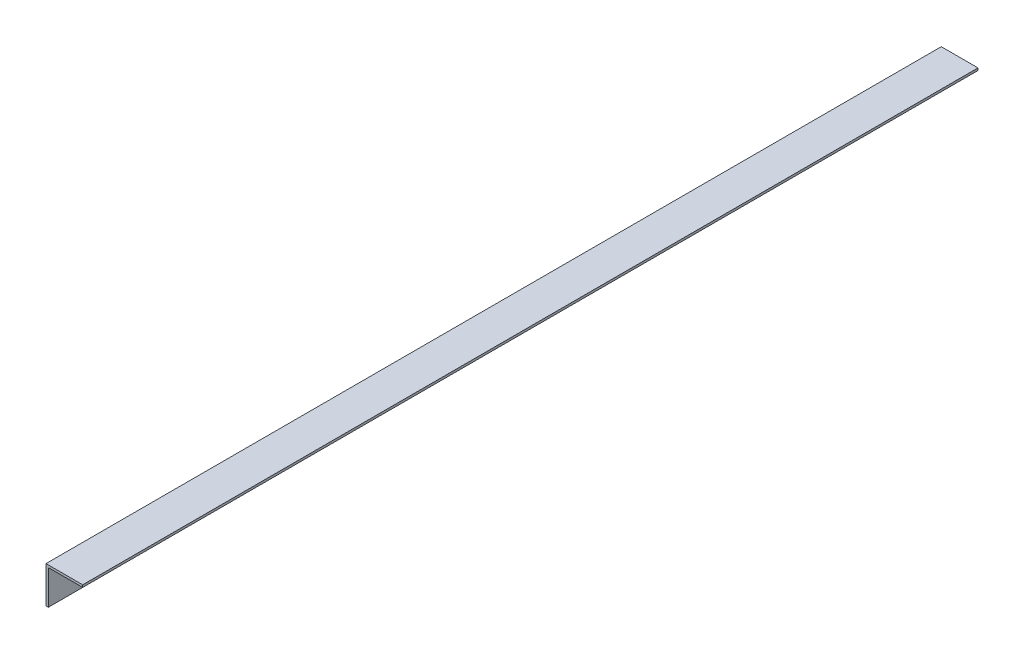
ISO-10303-21;
HEADER;
FILE_DESCRIPTION(('STEP AP214'),'2;1');
FILE_NAME('part.step','',(''),(''),'','','');
FILE_SCHEMA(('AUTOMOTIVE_DESIGN { 1 0 10303 214 1 1 1 1 }'));
ENDSEC;
DATA;
#1=APPLICATION_CONTEXT('core data for automotive mechanical design processes');
#2=APPLICATION_PROTOCOL_DEFINITION('international standard','automotive_design',2000,#1);
#3=PRODUCT_CONTEXT('',#1,'mechanical');
#4=PRODUCT('Part','Part','',(#3));
#5=PRODUCT_RELATED_PRODUCT_CATEGORY('part','',(#4));
#6=PRODUCT_DEFINITION_FORMATION('','',#4);
#7=PRODUCT_DEFINITION_CONTEXT('part definition',#1,'design');
#8=PRODUCT_DEFINITION('design','',#6,#7);
#9=PRODUCT_DEFINITION_SHAPE('','',#8);
#10=(LENGTH_UNIT() NAMED_UNIT(*) SI_UNIT(.MILLI.,.METRE.));
#11=(NAMED_UNIT(*) PLANE_ANGLE_UNIT() SI_UNIT($,.RADIAN.));
#12=(NAMED_UNIT(*) SI_UNIT($,.STERADIAN.) SOLID_ANGLE_UNIT());
#13=UNCERTAINTY_MEASURE_WITH_UNIT(LENGTH_MEASURE(1.E-05),#10,'distance_accuracy_value','');
#14=(GEOMETRIC_REPRESENTATION_CONTEXT(3) GLOBAL_UNCERTAINTY_ASSIGNED_CONTEXT((#13)) GLOBAL_UNIT_ASSIGNED_CONTEXT((#10,
#11,#12)) REPRESENTATION_CONTEXT('',''));
#15=CARTESIAN_POINT('',(0.,0.,0.));
#16=DIRECTION('',(0.,0.,1.));
#17=DIRECTION('',(1.,0.,0.));
#18=AXIS2_PLACEMENT_3D('',#15,#16,#17);
#19=CARTESIAN_POINT('',(38.,1074.,-800.));
#20=DIRECTION('',(-1.,0.,0.));
#21=DIRECTION('',(0.,0.,1.));
#22=AXIS2_PLACEMENT_3D('',#19,#20,#21);
#23=PLANE('',#22);
#24=DIRECTION('',(0.,-1.,0.));
#25=VECTOR('',#24,1.);
#26=CARTESIAN_POINT('',(38.,1074.,-20.));
#27=LINE('',#26,#25);
#28=CARTESIAN_POINT('',(38.,1074.,-20.));
#29=VERTEX_POINT('',#28);
#30=CARTESIAN_POINT('',(38.,1042.,-20.));
#31=VERTEX_POINT('',#30);
#32=EDGE_CURVE('E124',#29,#31,#27,.T.);
#33=ORIENTED_EDGE('',*,*,#32,.F.);
#34=DIRECTION('',(0.,0.,1.));
#35=VECTOR('',#34,1.);
#36=CARTESIAN_POINT('',(38.,1074.,-800.));
#37=LINE('',#36,#35);
#38=CARTESIAN_POINT('',(38.,1074.,-800.));
#39=VERTEX_POINT('',#38);
#40=EDGE_CURVE('E11',#39,#29,#37,.T.);
#41=ORIENTED_EDGE('',*,*,#40,.F.);
#42=DIRECTION('',(0.,-1.,0.));
#43=VECTOR('',#42,1.);
#44=CARTESIAN_POINT('',(38.,1074.,-800.));
#45=LINE('',#44,#43);
#46=CARTESIAN_POINT('',(38.,1042.,-800.));
#47=VERTEX_POINT('',#46);
#48=EDGE_CURVE('E138',#39,#47,#45,.T.);
#49=ORIENTED_EDGE('',*,*,#48,.T.);
#50=DIRECTION('',(0.,0.,1.));
#51=VECTOR('',#50,1.);
#52=CARTESIAN_POINT('',(38.,1042.,-800.));
#53=LINE('',#52,#51);
#54=EDGE_CURVE('E42',#47,#31,#53,.T.);
#55=ORIENTED_EDGE('',*,*,#54,.T.);
#56=EDGE_LOOP('',(#33,#41,#49,#55));
#57=FACE_BOUND('',#56,.T.);
#58=ADVANCED_FACE('F39',(#57),#23,.T.);
#59=CARTESIAN_POINT('',(70.,1074.,-800.));
#60=DIRECTION('',(0.,1.,0.));
#61=DIRECTION('',(0.,0.,1.));
#62=AXIS2_PLACEMENT_3D('',#59,#60,#61);
#63=PLANE('',#62);
#64=DIRECTION('',(-1.,0.,0.));
#65=VECTOR('',#64,1.);
#66=CARTESIAN_POINT('',(70.,1074.,-20.));
#67=LINE('',#66,#65);
#68=CARTESIAN_POINT('',(70.,1074.,-20.));
#69=VERTEX_POINT('',#68);
#70=EDGE_CURVE('E136',#69,#29,#67,.T.);
#71=ORIENTED_EDGE('',*,*,#70,.F.);
#72=DIRECTION('',(0.,0.,1.));
#73=VECTOR('',#72,1.);
#74=CARTESIAN_POINT('',(70.,1074.,-800.));
#75=LINE('',#74,#73);
#76=CARTESIAN_POINT('',(70.,1074.,-800.));
#77=VERTEX_POINT('',#76);
#78=EDGE_CURVE('E48',#77,#69,#75,.T.);
#79=ORIENTED_EDGE('',*,*,#78,.F.);
#80=DIRECTION('',(-1.,0.,0.));
#81=VECTOR('',#80,1.);
#82=CARTESIAN_POINT('',(70.,1074.,-800.));
#83=LINE('',#82,#81);
#84=EDGE_CURVE('E114',#77,#39,#83,.T.);
#85=ORIENTED_EDGE('',*,*,#84,.T.);
#86=ORIENTED_EDGE('',*,*,#40,.T.);
#87=EDGE_LOOP('',(#71,#79,#85,#86));
#88=FACE_BOUND('',#87,.T.);
#89=ADVANCED_FACE('F146',(#88),#63,.T.);
#90=CARTESIAN_POINT('',(70.,1072.,-800.));
#91=DIRECTION('',(1.,0.,0.));
#92=DIRECTION('',(0.,0.,-1.));
#93=AXIS2_PLACEMENT_3D('',#90,#91,#92);
#94=PLANE('',#93);
#95=DIRECTION('',(0.,1.,0.));
#96=VECTOR('',#95,1.);
#97=CARTESIAN_POINT('',(70.,1072.,-20.));
#98=LINE('',#97,#96);
#99=CARTESIAN_POINT('',(70.,1072.,-20.));
#100=VERTEX_POINT('',#99);
#101=EDGE_CURVE('E101',#100,#69,#98,.T.);
#102=ORIENTED_EDGE('',*,*,#101,.F.);
#103=DIRECTION('',(0.,0.,1.));
#104=VECTOR('',#103,1.);
#105=CARTESIAN_POINT('',(70.,1072.,-800.));
#106=LINE('',#105,#104);
#107=CARTESIAN_POINT('',(70.,1072.,-800.));
#108=VERTEX_POINT('',#107);
#109=EDGE_CURVE('E96',#108,#100,#106,.T.);
#110=ORIENTED_EDGE('',*,*,#109,.F.);
#111=DIRECTION('',(0.,1.,0.));
#112=VECTOR('',#111,1.);
#113=CARTESIAN_POINT('',(70.,1072.,-800.));
#114=LINE('',#113,#112);
#115=EDGE_CURVE('E99',#108,#77,#114,.T.);
#116=ORIENTED_EDGE('',*,*,#115,.T.);
#117=ORIENTED_EDGE('',*,*,#78,.T.);
#118=EDGE_LOOP('',(#102,#110,#116,#117));
#119=FACE_BOUND('',#118,.T.);
#120=ADVANCED_FACE('F98',(#119),#94,.T.);
#121=CARTESIAN_POINT('',(40.,1072.,-800.));
#122=DIRECTION('',(0.,-1.,0.));
#123=DIRECTION('',(0.,0.,-1.));
#124=AXIS2_PLACEMENT_3D('',#121,#122,#123);
#125=PLANE('',#124);
#126=DIRECTION('',(1.,0.,0.));
#127=VECTOR('',#126,1.);
#128=CARTESIAN_POINT('',(40.,1072.,-20.));
#129=LINE('',#128,#127);
#130=CARTESIAN_POINT('',(40.,1072.,-20.));
#131=VERTEX_POINT('',#130);
#132=EDGE_CURVE('E133',#131,#100,#129,.T.);
#133=ORIENTED_EDGE('',*,*,#132,.F.);
#134=DIRECTION('',(0.,0.,1.));
#135=VECTOR('',#134,1.);
#136=CARTESIAN_POINT('',(40.,1072.,-800.));
#137=LINE('',#136,#135);
#138=CARTESIAN_POINT('',(40.,1072.,-800.));
#139=VERTEX_POINT('',#138);
#140=EDGE_CURVE('E106',#139,#131,#137,.T.);
#141=ORIENTED_EDGE('',*,*,#140,.F.);
#142=DIRECTION('',(1.,0.,0.));
#143=VECTOR('',#142,1.);
#144=CARTESIAN_POINT('',(40.,1072.,-800.));
#145=LINE('',#144,#143);
#146=EDGE_CURVE('E112',#139,#108,#145,.T.);
#147=ORIENTED_EDGE('',*,*,#146,.T.);
#148=ORIENTED_EDGE('',*,*,#109,.T.);
#149=EDGE_LOOP('',(#133,#141,#147,#148));
#150=FACE_BOUND('',#149,.T.);
#151=ADVANCED_FACE('F116',(#150),#125,.T.);
#152=CARTESIAN_POINT('',(40.,1042.,-800.));
#153=DIRECTION('',(1.,0.,0.));
#154=DIRECTION('',(0.,0.,-1.));
#155=AXIS2_PLACEMENT_3D('',#152,#153,#154);
#156=PLANE('',#155);
#157=DIRECTION('',(0.,1.,0.));
#158=VECTOR('',#157,1.);
#159=CARTESIAN_POINT('',(40.,1042.,-20.));
#160=LINE('',#159,#158);
#161=CARTESIAN_POINT('',(40.,1042.,-20.));
#162=VERTEX_POINT('',#161);
#163=EDGE_CURVE('E130',#162,#131,#160,.T.);
#164=ORIENTED_EDGE('',*,*,#163,.F.);
#165=DIRECTION('',(0.,0.,1.));
#166=VECTOR('',#165,1.);
#167=CARTESIAN_POINT('',(40.,1042.,-800.));
#168=LINE('',#167,#166);
#169=CARTESIAN_POINT('',(40.,1042.,-800.));
#170=VERTEX_POINT('',#169);
#171=EDGE_CURVE('E141',#170,#162,#168,.T.);
#172=ORIENTED_EDGE('',*,*,#171,.F.);
#173=DIRECTION('',(0.,1.,0.));
#174=VECTOR('',#173,1.);
#175=CARTESIAN_POINT('',(40.,1042.,-800.));
#176=LINE('',#175,#174);
#177=EDGE_CURVE('E117',#170,#139,#176,.T.);
#178=ORIENTED_EDGE('',*,*,#177,.T.);
#179=ORIENTED_EDGE('',*,*,#140,.T.);
#180=EDGE_LOOP('',(#164,#172,#178,#179));
#181=FACE_BOUND('',#180,.T.);
#182=ADVANCED_FACE('F159',(#181),#156,.T.);
#183=CARTESIAN_POINT('',(38.,1042.,-800.));
#184=DIRECTION('',(0.,-1.,0.));
#185=DIRECTION('',(0.,0.,-1.));
#186=AXIS2_PLACEMENT_3D('',#183,#184,#185);
#187=PLANE('',#186);
#188=DIRECTION('',(1.,0.,0.));
#189=VECTOR('',#188,1.);
#190=CARTESIAN_POINT('',(38.,1042.,-20.));
#191=LINE('',#190,#189);
#192=EDGE_CURVE('E127',#31,#162,#191,.T.);
#193=ORIENTED_EDGE('',*,*,#192,.F.);
#194=ORIENTED_EDGE('',*,*,#54,.F.);
#195=DIRECTION('',(1.,0.,0.));
#196=VECTOR('',#195,1.);
#197=CARTESIAN_POINT('',(38.,1042.,-800.));
#198=LINE('',#197,#196);
#199=EDGE_CURVE('E119',#47,#170,#198,.T.);
#200=ORIENTED_EDGE('',*,*,#199,.T.);
#201=ORIENTED_EDGE('',*,*,#171,.T.);
#202=EDGE_LOOP('',(#193,#194,#200,#201));
#203=FACE_BOUND('',#202,.T.);
#204=ADVANCED_FACE('F143',(#203),#187,.T.);
#205=CARTESIAN_POINT('',(0.,0.,-800.));
#206=DIRECTION('',(0.,0.,1.));
#207=DIRECTION('',(1.,0.,0.));
#208=AXIS2_PLACEMENT_3D('',#205,#206,#207);
#209=PLANE('',#208);
#210=ORIENTED_EDGE('',*,*,#48,.F.);
#211=ORIENTED_EDGE('',*,*,#84,.F.);
#212=ORIENTED_EDGE('',*,*,#115,.F.);
#213=ORIENTED_EDGE('',*,*,#146,.F.);
#214=ORIENTED_EDGE('',*,*,#177,.F.);
#215=ORIENTED_EDGE('',*,*,#199,.F.);
#216=EDGE_LOOP('',(#210,#211,#212,#213,#214,#215));
#217=FACE_BOUND('',#216,.T.);
#218=ADVANCED_FACE('F110',(#217),#209,.F.);
#219=CARTESIAN_POINT('',(0.,0.,-20.));
#220=DIRECTION('',(0.,0.,1.));
#221=DIRECTION('',(1.,0.,0.));
#222=AXIS2_PLACEMENT_3D('',#219,#220,#221);
#223=PLANE('',#222);
#224=ORIENTED_EDGE('',*,*,#32,.T.);
#225=ORIENTED_EDGE('',*,*,#192,.T.);
#226=ORIENTED_EDGE('',*,*,#163,.T.);
#227=ORIENTED_EDGE('',*,*,#132,.T.);
#228=ORIENTED_EDGE('',*,*,#101,.T.);
#229=ORIENTED_EDGE('',*,*,#70,.T.);
#230=EDGE_LOOP('',(#224,#225,#226,#227,#228,#229));
#231=FACE_BOUND('',#230,.T.);
#232=ADVANCED_FACE('F145',(#231),#223,.T.);
#233=CLOSED_SHELL('',(#58,#89,#120,#151,#182,#204,#218,#232));
#234=MANIFOLD_SOLID_BREP('B2',#233);
#235=ADVANCED_BREP_SHAPE_REPRESENTATION('',(#18,#234),#14);
#236=SHAPE_DEFINITION_REPRESENTATION(#9,#235);
ENDSEC;
END-ISO-10303-21;
